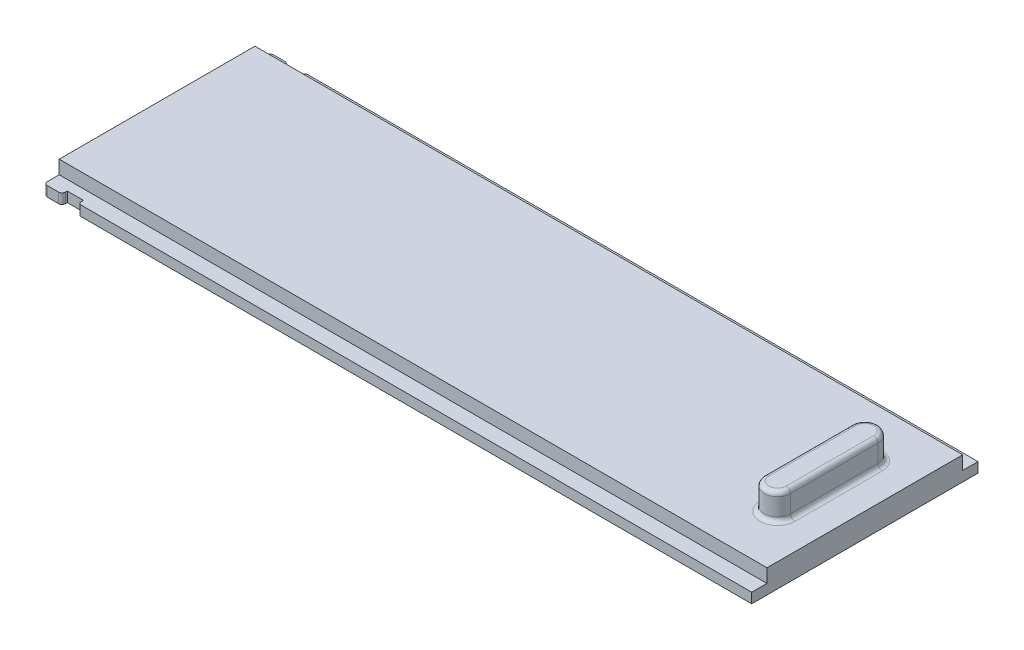
ISO-10303-21;
HEADER;
FILE_DESCRIPTION(('STEP AP214'),'2;1');
FILE_NAME('part.step','',(''),(''),'','','');
FILE_SCHEMA(('AUTOMOTIVE_DESIGN { 1 0 10303 214 1 1 1 1 }'));
ENDSEC;
DATA;
#1=APPLICATION_CONTEXT('core data for automotive mechanical design processes');
#2=APPLICATION_PROTOCOL_DEFINITION('international standard','automotive_design',2000,#1);
#3=PRODUCT_CONTEXT('',#1,'mechanical');
#4=PRODUCT('Part','Part','',(#3));
#5=PRODUCT_RELATED_PRODUCT_CATEGORY('part','',(#4));
#6=PRODUCT_DEFINITION_FORMATION('','',#4);
#7=PRODUCT_DEFINITION_CONTEXT('part definition',#1,'design');
#8=PRODUCT_DEFINITION('design','',#6,#7);
#9=PRODUCT_DEFINITION_SHAPE('','',#8);
#10=(LENGTH_UNIT() NAMED_UNIT(*) SI_UNIT(.MILLI.,.METRE.));
#11=(NAMED_UNIT(*) PLANE_ANGLE_UNIT() SI_UNIT($,.RADIAN.));
#12=(NAMED_UNIT(*) SI_UNIT($,.STERADIAN.) SOLID_ANGLE_UNIT());
#13=UNCERTAINTY_MEASURE_WITH_UNIT(LENGTH_MEASURE(1.E-05),#10,'distance_accuracy_value','');
#14=(GEOMETRIC_REPRESENTATION_CONTEXT(3) GLOBAL_UNCERTAINTY_ASSIGNED_CONTEXT((#13)) GLOBAL_UNIT_ASSIGNED_CONTEXT((#10,
#11,#12)) REPRESENTATION_CONTEXT('',''));
#15=CARTESIAN_POINT('',(0.,0.,0.));
#16=DIRECTION('',(0.,0.,1.));
#17=DIRECTION('',(1.,0.,0.));
#18=AXIS2_PLACEMENT_3D('',#15,#16,#17);
#19=CARTESIAN_POINT('',(0.,3.,0.));
#20=DIRECTION('',(0.,-1.,0.));
#21=DIRECTION('',(0.,0.,-1.));
#22=AXIS2_PLACEMENT_3D('',#19,#20,#21);
#23=PLANE('',#22);
#24=CARTESIAN_POINT('',(76.,3.,-9.49999999999999));
#25=DIRECTION('',(0.,-1.,0.));
#26=DIRECTION('',(0.,0.,-1.));
#27=AXIS2_PLACEMENT_3D('',#24,#25,#26);
#28=CIRCLE('',#27,2.);
#29=CARTESIAN_POINT('',(78.,3.,-9.49999999999999));
#30=VERTEX_POINT('',#29);
#31=CARTESIAN_POINT('',(74.,3.,-9.49999999999999));
#32=VERTEX_POINT('',#31);
#33=EDGE_CURVE('E369',#30,#32,#28,.T.);
#34=ORIENTED_EDGE('',*,*,#33,.T.);
#35=DIRECTION('',(0.,0.,1.));
#36=VECTOR('',#35,1.);
#37=CARTESIAN_POINT('',(74.,3.,-19.5));
#38=LINE('',#37,#36);
#39=CARTESIAN_POINT('',(74.,3.,-19.5));
#40=VERTEX_POINT('',#39);
#41=EDGE_CURVE('E375',#32,#40,#38,.F.);
#42=ORIENTED_EDGE('',*,*,#41,.T.);
#43=CARTESIAN_POINT('',(76.,3.,-19.5));
#44=DIRECTION('',(0.,-1.,0.));
#45=DIRECTION('',(0.,0.,-1.));
#46=AXIS2_PLACEMENT_3D('',#43,#44,#45);
#47=CIRCLE('',#46,2.);
#48=CARTESIAN_POINT('',(78.,3.,-19.5));
#49=VERTEX_POINT('',#48);
#50=EDGE_CURVE('E373',#40,#49,#47,.T.);
#51=ORIENTED_EDGE('',*,*,#50,.T.);
#52=DIRECTION('',(0.,0.,-1.));
#53=VECTOR('',#52,1.);
#54=CARTESIAN_POINT('',(78.,3.,-9.49999999999999));
#55=LINE('',#54,#53);
#56=EDGE_CURVE('E371',#49,#30,#55,.F.);
#57=ORIENTED_EDGE('',*,*,#56,.T.);
#58=EDGE_LOOP('',(#34,#42,#51,#57));
#59=FACE_BOUND('',#58,.T.);
#60=DIRECTION('',(0.,0.,-1.));
#61=VECTOR('',#60,1.);
#62=CARTESIAN_POINT('',(81.,3.,0.));
#63=LINE('',#62,#61);
#64=CARTESIAN_POINT('',(81.,3.,-3.3));
#65=VERTEX_POINT('',#64);
#66=CARTESIAN_POINT('',(81.,3.,-25.7));
#67=VERTEX_POINT('',#66);
#68=EDGE_CURVE('E299',#65,#67,#63,.T.);
#69=ORIENTED_EDGE('',*,*,#68,.T.);
#70=DIRECTION('',(1.,0.,0.));
#71=VECTOR('',#70,1.);
#72=CARTESIAN_POINT('',(-3.63352445980483,3.,-25.7));
#73=LINE('',#72,#71);
#74=CARTESIAN_POINT('',(0.,3.,-25.7));
#75=VERTEX_POINT('',#74);
#76=EDGE_CURVE('E262',#75,#67,#73,.T.);
#77=ORIENTED_EDGE('',*,*,#76,.F.);
#78=DIRECTION('',(0.,0.,1.));
#79=VECTOR('',#78,1.);
#80=CARTESIAN_POINT('',(0.,3.,0.));
#81=LINE('',#80,#79);
#82=CARTESIAN_POINT('',(0.,3.,-3.3));
#83=VERTEX_POINT('',#82);
#84=EDGE_CURVE('E296',#75,#83,#81,.T.);
#85=ORIENTED_EDGE('',*,*,#84,.T.);
#86=DIRECTION('',(1.,0.,0.));
#87=VECTOR('',#86,1.);
#88=CARTESIAN_POINT('',(-3.63352445980483,3.,-3.3));
#89=LINE('',#88,#87);
#90=EDGE_CURVE('E282',#83,#65,#89,.T.);
#91=ORIENTED_EDGE('',*,*,#90,.T.);
#92=EDGE_LOOP('',(#69,#77,#85,#91));
#93=FACE_BOUND('',#92,.T.);
#94=ADVANCED_FACE('F41',(#59,#93),#23,.F.);
#95=CARTESIAN_POINT('',(-3.63352445980483,0.,-27.45));
#96=DIRECTION('',(0.,0.,1.));
#97=DIRECTION('',(0.,-1.,0.));
#98=AXIS2_PLACEMENT_3D('',#95,#96,#97);
#99=PLANE('',#98);
#100=DIRECTION('',(0.,-1.,0.));
#101=VECTOR('',#100,1.);
#102=CARTESIAN_POINT('',(81.,0.,-27.45));
#103=LINE('',#102,#101);
#104=CARTESIAN_POINT('',(81.,1.45,-27.45));
#105=VERTEX_POINT('',#104);
#106=CARTESIAN_POINT('',(81.,0.3,-27.45));
#107=VERTEX_POINT('',#106);
#108=EDGE_CURVE('E254',#105,#107,#103,.T.);
#109=ORIENTED_EDGE('',*,*,#108,.T.);
#110=DIRECTION('',(1.,0.,0.));
#111=VECTOR('',#110,1.);
#112=CARTESIAN_POINT('',(-25.9001930494736,0.3,-27.45));
#113=LINE('',#112,#111);
#114=CARTESIAN_POINT('',(4.12500000000001,0.3,-27.45));
#115=VERTEX_POINT('',#114);
#116=EDGE_CURVE('E237',#115,#107,#113,.T.);
#117=ORIENTED_EDGE('',*,*,#116,.F.);
#118=DIRECTION('',(0.,1.,0.));
#119=VECTOR('',#118,1.);
#120=CARTESIAN_POINT('',(4.12500000000001,0.,-27.45));
#121=LINE('',#120,#119);
#122=CARTESIAN_POINT('',(4.12500000000001,1.45,-27.45));
#123=VERTEX_POINT('',#122);
#124=EDGE_CURVE('E328',#115,#123,#121,.T.);
#125=ORIENTED_EDGE('',*,*,#124,.T.);
#126=DIRECTION('',(1.,0.,0.));
#127=VECTOR('',#126,1.);
#128=CARTESIAN_POINT('',(-3.63352445980483,1.45,-27.45));
#129=LINE('',#128,#127);
#130=EDGE_CURVE('E260',#123,#105,#129,.T.);
#131=ORIENTED_EDGE('',*,*,#130,.T.);
#132=EDGE_LOOP('',(#109,#117,#125,#131));
#133=FACE_BOUND('',#132,.T.);
#134=ADVANCED_FACE('F258',(#133),#99,.F.);
#135=CARTESIAN_POINT('',(-3.63352445980483,0.,-1.55));
#136=DIRECTION('',(0.,0.,-1.));
#137=DIRECTION('',(0.,1.,0.));
#138=AXIS2_PLACEMENT_3D('',#135,#136,#137);
#139=PLANE('',#138);
#140=DIRECTION('',(0.,-1.,0.));
#141=VECTOR('',#140,1.);
#142=CARTESIAN_POINT('',(4.125,0.,-1.55));
#143=LINE('',#142,#141);
#144=CARTESIAN_POINT('',(4.125,1.45,-1.55));
#145=VERTEX_POINT('',#144);
#146=CARTESIAN_POINT('',(4.125,0.3,-1.55));
#147=VERTEX_POINT('',#146);
#148=EDGE_CURVE('E310',#145,#147,#143,.T.);
#149=ORIENTED_EDGE('',*,*,#148,.T.);
#150=DIRECTION('',(1.,0.,0.));
#151=VECTOR('',#150,1.);
#152=CARTESIAN_POINT('',(-25.9001930494736,0.3,-1.55));
#153=LINE('',#152,#151);
#154=CARTESIAN_POINT('',(81.,0.3,-1.55));
#155=VERTEX_POINT('',#154);
#156=EDGE_CURVE('E526',#147,#155,#153,.T.);
#157=ORIENTED_EDGE('',*,*,#156,.T.);
#158=DIRECTION('',(0.,1.,0.));
#159=VECTOR('',#158,1.);
#160=CARTESIAN_POINT('',(81.,0.,-1.55));
#161=LINE('',#160,#159);
#162=CARTESIAN_POINT('',(81.,1.45,-1.55));
#163=VERTEX_POINT('',#162);
#164=EDGE_CURVE('E256',#155,#163,#161,.T.);
#165=ORIENTED_EDGE('',*,*,#164,.T.);
#166=DIRECTION('',(1.,0.,0.));
#167=VECTOR('',#166,1.);
#168=CARTESIAN_POINT('',(-3.63352445980483,1.45,-1.55));
#169=LINE('',#168,#167);
#170=EDGE_CURVE('E279',#145,#163,#169,.T.);
#171=ORIENTED_EDGE('',*,*,#170,.F.);
#172=EDGE_LOOP('',(#149,#157,#165,#171));
#173=FACE_BOUND('',#172,.T.);
#174=ADVANCED_FACE('F548',(#173),#139,.F.);
#175=CARTESIAN_POINT('',(0.,3.,0.));
#176=DIRECTION('',(1.,0.,0.));
#177=DIRECTION('',(0.,0.,-1.));
#178=AXIS2_PLACEMENT_3D('',#175,#176,#177);
#179=PLANE('',#178);
#180=DIRECTION('',(0.,1.,0.));
#181=VECTOR('',#180,1.);
#182=CARTESIAN_POINT('',(0.,2.99999999999994,-27.05));
#183=LINE('',#182,#181);
#184=CARTESIAN_POINT('',(0.,1.45,-27.05));
#185=VERTEX_POINT('',#184);
#186=CARTESIAN_POINT('',(0.,0.3,-27.05));
#187=VERTEX_POINT('',#186);
#188=EDGE_CURVE('E338',#185,#187,#183,.F.);
#189=ORIENTED_EDGE('',*,*,#188,.T.);
#190=DIRECTION('',(0.,0.,-1.));
#191=VECTOR('',#190,1.);
#192=CARTESIAN_POINT('',(0.,0.3,-1.55));
#193=LINE('',#192,#191);
#194=CARTESIAN_POINT('',(0.,0.3,-1.95));
#195=VERTEX_POINT('',#194);
#196=EDGE_CURVE('E491',#195,#187,#193,.T.);
#197=ORIENTED_EDGE('',*,*,#196,.F.);
#198=DIRECTION('',(0.,-1.,0.));
#199=VECTOR('',#198,1.);
#200=CARTESIAN_POINT('',(0.,3.,-1.95));
#201=LINE('',#200,#199);
#202=CARTESIAN_POINT('',(0.,1.45,-1.95));
#203=VERTEX_POINT('',#202);
#204=EDGE_CURVE('E336',#195,#203,#201,.F.);
#205=ORIENTED_EDGE('',*,*,#204,.T.);
#206=DIRECTION('',(0.,0.,1.));
#207=VECTOR('',#206,1.);
#208=CARTESIAN_POINT('',(0.,1.45,-1.55));
#209=LINE('',#208,#207);
#210=CARTESIAN_POINT('',(0.,1.45,-3.3));
#211=VERTEX_POINT('',#210);
#212=EDGE_CURVE('E285',#211,#203,#209,.T.);
#213=ORIENTED_EDGE('',*,*,#212,.F.);
#214=DIRECTION('',(0.,-1.,0.));
#215=VECTOR('',#214,1.);
#216=CARTESIAN_POINT('',(0.,1.45,-3.3));
#217=LINE('',#216,#215);
#218=EDGE_CURVE('E291',#83,#211,#217,.T.);
#219=ORIENTED_EDGE('',*,*,#218,.F.);
#220=ORIENTED_EDGE('',*,*,#84,.F.);
#221=DIRECTION('',(0.,1.,0.));
#222=VECTOR('',#221,1.);
#223=CARTESIAN_POINT('',(0.,1.45,-25.7));
#224=LINE('',#223,#222);
#225=CARTESIAN_POINT('',(0.,1.45,-25.7));
#226=VERTEX_POINT('',#225);
#227=EDGE_CURVE('E273',#226,#75,#224,.T.);
#228=ORIENTED_EDGE('',*,*,#227,.F.);
#229=DIRECTION('',(0.,0.,1.));
#230=VECTOR('',#229,1.);
#231=CARTESIAN_POINT('',(0.,1.45,-27.45));
#232=LINE('',#231,#230);
#233=EDGE_CURVE('E300',#185,#226,#232,.T.);
#234=ORIENTED_EDGE('',*,*,#233,.F.);
#235=EDGE_LOOP('',(#189,#197,#205,#213,#219,#220,#228,#234));
#236=FACE_BOUND('',#235,.T.);
#237=ADVANCED_FACE('F482',(#236),#179,.F.);
#238=CARTESIAN_POINT('',(81.,3.,0.));
#239=DIRECTION('',(-1.,0.,0.));
#240=DIRECTION('',(0.,0.,1.));
#241=AXIS2_PLACEMENT_3D('',#238,#239,#240);
#242=PLANE('',#241);
#243=ORIENTED_EDGE('',*,*,#164,.F.);
#244=DIRECTION('',(0.,0.,1.));
#245=VECTOR('',#244,1.);
#246=CARTESIAN_POINT('',(81.,0.3,-1.55));
#247=LINE('',#246,#245);
#248=EDGE_CURVE('E240',#107,#155,#247,.T.);
#249=ORIENTED_EDGE('',*,*,#248,.F.);
#250=ORIENTED_EDGE('',*,*,#108,.F.);
#251=DIRECTION('',(0.,0.,-1.));
#252=VECTOR('',#251,1.);
#253=CARTESIAN_POINT('',(81.,1.45,-27.45));
#254=LINE('',#253,#252);
#255=CARTESIAN_POINT('',(81.,1.45,-25.7));
#256=VERTEX_POINT('',#255);
#257=EDGE_CURVE('E263',#256,#105,#254,.T.);
#258=ORIENTED_EDGE('',*,*,#257,.F.);
#259=DIRECTION('',(0.,-1.,0.));
#260=VECTOR('',#259,1.);
#261=CARTESIAN_POINT('',(81.,1.45,-25.7));
#262=LINE('',#261,#260);
#263=EDGE_CURVE('E267',#67,#256,#262,.T.);
#264=ORIENTED_EDGE('',*,*,#263,.F.);
#265=ORIENTED_EDGE('',*,*,#68,.F.);
#266=DIRECTION('',(0.,1.,0.));
#267=VECTOR('',#266,1.);
#268=CARTESIAN_POINT('',(81.,1.45,-3.3));
#269=LINE('',#268,#267);
#270=CARTESIAN_POINT('',(81.,1.45,-3.3));
#271=VERTEX_POINT('',#270);
#272=EDGE_CURVE('E278',#271,#65,#269,.T.);
#273=ORIENTED_EDGE('',*,*,#272,.F.);
#274=DIRECTION('',(0.,0.,-1.));
#275=VECTOR('',#274,1.);
#276=CARTESIAN_POINT('',(81.,1.45,-1.55));
#277=LINE('',#276,#275);
#278=EDGE_CURVE('E287',#163,#271,#277,.T.);
#279=ORIENTED_EDGE('',*,*,#278,.F.);
#280=EDGE_LOOP('',(#243,#249,#250,#258,#264,#265,#273,#279));
#281=FACE_BOUND('',#280,.T.);
#282=ADVANCED_FACE('F252',(#281),#242,.F.);
#283=CARTESIAN_POINT('',(-3.63352445980483,1.45,-3.3));
#284=DIRECTION('',(0.,0.,-1.));
#285=DIRECTION('',(0.,1.,0.));
#286=AXIS2_PLACEMENT_3D('',#283,#284,#285);
#287=PLANE('',#286);
#288=ORIENTED_EDGE('',*,*,#218,.T.);
#289=DIRECTION('',(1.,0.,0.));
#290=VECTOR('',#289,1.);
#291=CARTESIAN_POINT('',(-3.63352445980483,1.45,-3.3));
#292=LINE('',#291,#290);
#293=EDGE_CURVE('E280',#211,#271,#292,.T.);
#294=ORIENTED_EDGE('',*,*,#293,.T.);
#295=ORIENTED_EDGE('',*,*,#272,.T.);
#296=ORIENTED_EDGE('',*,*,#90,.F.);
#297=EDGE_LOOP('',(#288,#294,#295,#296));
#298=FACE_BOUND('',#297,.T.);
#299=ADVANCED_FACE('F552',(#298),#287,.F.);
#300=CARTESIAN_POINT('',(-3.63352445980483,1.45,-1.55));
#301=DIRECTION('',(0.,-1.,0.));
#302=DIRECTION('',(0.,0.,-1.));
#303=AXIS2_PLACEMENT_3D('',#300,#301,#302);
#304=PLANE('',#303);
#305=ORIENTED_EDGE('',*,*,#212,.T.);
#306=CARTESIAN_POINT('',(0.4,1.45,-1.95));
#307=DIRECTION('',(0.,-1.,0.));
#308=DIRECTION('',(0.,0.,-1.));
#309=AXIS2_PLACEMENT_3D('',#306,#307,#308);
#310=CIRCLE('',#309,0.4);
#311=CARTESIAN_POINT('',(0.4,1.45,-1.55));
#312=VERTEX_POINT('',#311);
#313=EDGE_CURVE('E344',#203,#312,#310,.F.);
#314=ORIENTED_EDGE('',*,*,#313,.T.);
#315=CARTESIAN_POINT('',(1.675,1.45,-1.55));
#316=VERTEX_POINT('',#315);
#317=EDGE_CURVE('E275',#312,#316,#169,.T.);
#318=ORIENTED_EDGE('',*,*,#317,.T.);
#319=CARTESIAN_POINT('',(1.675,1.45,-1.95));
#320=DIRECTION('',(0.,-1.,0.));
#321=DIRECTION('',(0.,0.,-1.));
#322=AXIS2_PLACEMENT_3D('',#319,#320,#321);
#323=CIRCLE('',#322,0.4);
#324=CARTESIAN_POINT('',(2.075,1.45,-1.95));
#325=VERTEX_POINT('',#324);
#326=EDGE_CURVE('E308',#316,#325,#323,.F.);
#327=ORIENTED_EDGE('',*,*,#326,.T.);
#328=DIRECTION('',(0.,0.,1.));
#329=VECTOR('',#328,1.);
#330=CARTESIAN_POINT('',(2.075,1.45,-2.15));
#331=LINE('',#330,#329);
#332=CARTESIAN_POINT('',(2.075,1.45,-2.15));
#333=VERTEX_POINT('',#332);
#334=EDGE_CURVE('E293',#333,#325,#331,.T.);
#335=ORIENTED_EDGE('',*,*,#334,.F.);
#336=DIRECTION('',(-1.,0.,0.));
#337=VECTOR('',#336,1.);
#338=CARTESIAN_POINT('',(2.075,1.45,-2.15));
#339=LINE('',#338,#337);
#340=CARTESIAN_POINT('',(3.925,1.45,-2.15));
#341=VERTEX_POINT('',#340);
#342=EDGE_CURVE('E454',#341,#333,#339,.T.);
#343=ORIENTED_EDGE('',*,*,#342,.F.);
#344=DIRECTION('',(0.,0.,1.));
#345=VECTOR('',#344,1.);
#346=CARTESIAN_POINT('',(3.925,1.45,-2.15));
#347=LINE('',#346,#345);
#348=CARTESIAN_POINT('',(3.925,1.45,-1.75));
#349=VERTEX_POINT('',#348);
#350=EDGE_CURVE('E460',#341,#349,#347,.T.);
#351=ORIENTED_EDGE('',*,*,#350,.T.);
#352=DIRECTION('',(-0.707106781186543,0.,-0.707106781186552));
#353=VECTOR('',#352,1.);
#354=CARTESIAN_POINT('',(4.125,1.45,-1.55));
#355=LINE('',#354,#353);
#356=EDGE_CURVE('E315',#349,#145,#355,.F.);
#357=ORIENTED_EDGE('',*,*,#356,.T.);
#358=ORIENTED_EDGE('',*,*,#170,.T.);
#359=ORIENTED_EDGE('',*,*,#278,.T.);
#360=ORIENTED_EDGE('',*,*,#293,.F.);
#361=EDGE_LOOP('',(#305,#314,#318,#327,#335,#343,#351,#357,#358,#359,#360));
#362=FACE_BOUND('',#361,.T.);
#363=ADVANCED_FACE('F531',(#362),#304,.F.);
#364=DIRECTION('',(0.,-1.,0.));
#365=VECTOR('',#364,1.);
#366=CARTESIAN_POINT('',(0.4,0.,-1.55));
#367=LINE('',#366,#365);
#368=CARTESIAN_POINT('',(0.4,0.3,-1.55));
#369=VERTEX_POINT('',#368);
#370=EDGE_CURVE('E341',#312,#369,#367,.T.);
#371=ORIENTED_EDGE('',*,*,#370,.T.);
#372=CARTESIAN_POINT('',(1.675,0.3,-1.55));
#373=VERTEX_POINT('',#372);
#374=EDGE_CURVE('E55',#369,#373,#153,.T.);
#375=ORIENTED_EDGE('',*,*,#374,.T.);
#376=DIRECTION('',(0.,-1.,0.));
#377=VECTOR('',#376,1.);
#378=CARTESIAN_POINT('',(1.675,0.,-1.55));
#379=LINE('',#378,#377);
#380=EDGE_CURVE('E306',#373,#316,#379,.F.);
#381=ORIENTED_EDGE('',*,*,#380,.T.);
#382=ORIENTED_EDGE('',*,*,#317,.F.);
#383=EDGE_LOOP('',(#371,#375,#381,#382));
#384=FACE_BOUND('',#383,.T.);
#385=ADVANCED_FACE('F523',(#384),#139,.F.);
#386=DIRECTION('',(0.,1.,0.));
#387=VECTOR('',#386,1.);
#388=CARTESIAN_POINT('',(1.675,0.,-27.45));
#389=LINE('',#388,#387);
#390=CARTESIAN_POINT('',(1.675,1.45,-27.45));
#391=VERTEX_POINT('',#390);
#392=CARTESIAN_POINT('',(1.675,0.3,-27.45));
#393=VERTEX_POINT('',#392);
#394=EDGE_CURVE('E322',#391,#393,#389,.F.);
#395=ORIENTED_EDGE('',*,*,#394,.T.);
#396=CARTESIAN_POINT('',(0.400000000000001,0.3,-27.45));
#397=VERTEX_POINT('',#396);
#398=EDGE_CURVE('E247',#397,#393,#113,.T.);
#399=ORIENTED_EDGE('',*,*,#398,.F.);
#400=DIRECTION('',(0.,1.,0.));
#401=VECTOR('',#400,1.);
#402=CARTESIAN_POINT('',(0.4,0.,-27.45));
#403=LINE('',#402,#401);
#404=CARTESIAN_POINT('',(0.4,1.45,-27.45));
#405=VERTEX_POINT('',#404);
#406=EDGE_CURVE('E332',#397,#405,#403,.T.);
#407=ORIENTED_EDGE('',*,*,#406,.T.);
#408=EDGE_CURVE('E271',#405,#391,#129,.T.);
#409=ORIENTED_EDGE('',*,*,#408,.T.);
#410=EDGE_LOOP('',(#395,#399,#407,#409));
#411=FACE_BOUND('',#410,.T.);
#412=ADVANCED_FACE('F578',(#411),#99,.F.);
#413=CARTESIAN_POINT('',(-3.63352445980483,1.45,-27.45));
#414=DIRECTION('',(0.,-1.,0.));
#415=DIRECTION('',(0.,0.,-1.));
#416=AXIS2_PLACEMENT_3D('',#413,#414,#415);
#417=PLANE('',#416);
#418=ORIENTED_EDGE('',*,*,#408,.F.);
#419=CARTESIAN_POINT('',(0.4,1.45,-27.05));
#420=DIRECTION('',(0.,-1.,0.));
#421=DIRECTION('',(0.,0.,-1.));
#422=AXIS2_PLACEMENT_3D('',#419,#420,#421);
#423=CIRCLE('',#422,0.4);
#424=EDGE_CURVE('E334',#405,#185,#423,.F.);
#425=ORIENTED_EDGE('',*,*,#424,.T.);
#426=ORIENTED_EDGE('',*,*,#233,.T.);
#427=DIRECTION('',(1.,0.,0.));
#428=VECTOR('',#427,1.);
#429=CARTESIAN_POINT('',(-3.63352445980483,1.45,-25.7));
#430=LINE('',#429,#428);
#431=EDGE_CURVE('E265',#226,#256,#430,.T.);
#432=ORIENTED_EDGE('',*,*,#431,.T.);
#433=ORIENTED_EDGE('',*,*,#257,.T.);
#434=ORIENTED_EDGE('',*,*,#130,.F.);
#435=DIRECTION('',(0.707106781186548,0.,-0.707106781186548));
#436=VECTOR('',#435,1.);
#437=CARTESIAN_POINT('',(3.925,1.45,-27.25));
#438=LINE('',#437,#436);
#439=CARTESIAN_POINT('',(3.925,1.45,-27.25));
#440=VERTEX_POINT('',#439);
#441=EDGE_CURVE('E330',#123,#440,#438,.F.);
#442=ORIENTED_EDGE('',*,*,#441,.T.);
#443=DIRECTION('',(0.,0.,-1.));
#444=VECTOR('',#443,1.);
#445=CARTESIAN_POINT('',(3.925,1.45,-26.85));
#446=LINE('',#445,#444);
#447=CARTESIAN_POINT('',(3.925,1.45,-26.85));
#448=VERTEX_POINT('',#447);
#449=EDGE_CURVE('E447',#448,#440,#446,.T.);
#450=ORIENTED_EDGE('',*,*,#449,.F.);
#451=DIRECTION('',(1.,0.,0.));
#452=VECTOR('',#451,1.);
#453=CARTESIAN_POINT('',(2.075,1.45,-26.85));
#454=LINE('',#453,#452);
#455=CARTESIAN_POINT('',(2.075,1.45,-26.85));
#456=VERTEX_POINT('',#455);
#457=EDGE_CURVE('E443',#456,#448,#454,.T.);
#458=ORIENTED_EDGE('',*,*,#457,.F.);
#459=DIRECTION('',(0.,0.,-1.));
#460=VECTOR('',#459,1.);
#461=CARTESIAN_POINT('',(2.075,1.45,-26.85));
#462=LINE('',#461,#460);
#463=CARTESIAN_POINT('',(2.075,1.45,-27.05));
#464=VERTEX_POINT('',#463);
#465=EDGE_CURVE('E446',#456,#464,#462,.T.);
#466=ORIENTED_EDGE('',*,*,#465,.T.);
#467=CARTESIAN_POINT('',(1.675,1.45,-27.05));
#468=DIRECTION('',(0.,-1.,0.));
#469=DIRECTION('',(0.,0.,-1.));
#470=AXIS2_PLACEMENT_3D('',#467,#468,#469);
#471=CIRCLE('',#470,0.4);
#472=EDGE_CURVE('E319',#464,#391,#471,.F.);
#473=ORIENTED_EDGE('',*,*,#472,.T.);
#474=EDGE_LOOP('',(#418,#425,#426,#432,#433,#434,#442,#450,#458,#466,#473));
#475=FACE_BOUND('',#474,.T.);
#476=ADVANCED_FACE('F476',(#475),#417,.F.);
#477=CARTESIAN_POINT('',(-3.63352445980483,1.45,-25.7));
#478=DIRECTION('',(0.,0.,1.));
#479=DIRECTION('',(1.,0.,0.));
#480=AXIS2_PLACEMENT_3D('',#477,#478,#479);
#481=PLANE('',#480);
#482=ORIENTED_EDGE('',*,*,#227,.T.);
#483=ORIENTED_EDGE('',*,*,#76,.T.);
#484=ORIENTED_EDGE('',*,*,#263,.T.);
#485=ORIENTED_EDGE('',*,*,#431,.F.);
#486=EDGE_LOOP('',(#482,#483,#484,#485));
#487=FACE_BOUND('',#486,.T.);
#488=ADVANCED_FACE('F470',(#487),#481,.F.);
#489=CARTESIAN_POINT('',(3.925,-0.0999999999999997,-2.15));
#490=DIRECTION('',(1.,0.,0.));
#491=DIRECTION('',(0.,0.,-1.));
#492=AXIS2_PLACEMENT_3D('',#489,#490,#491);
#493=PLANE('',#492);
#494=DIRECTION('',(0.,1.,0.));
#495=VECTOR('',#494,1.);
#496=CARTESIAN_POINT('',(3.925,-0.0999999999999997,-2.15));
#497=LINE('',#496,#495);
#498=CARTESIAN_POINT('',(3.925,0.3,-2.15));
#499=VERTEX_POINT('',#498);
#500=EDGE_CURVE('E450',#499,#341,#497,.T.);
#501=ORIENTED_EDGE('',*,*,#500,.F.);
#502=DIRECTION('',(0.,0.,1.));
#503=VECTOR('',#502,1.);
#504=CARTESIAN_POINT('',(3.925,0.3,-2.15));
#505=LINE('',#504,#503);
#506=CARTESIAN_POINT('',(3.925,0.3,-1.75));
#507=VERTEX_POINT('',#506);
#508=EDGE_CURVE('E510',#499,#507,#505,.T.);
#509=ORIENTED_EDGE('',*,*,#508,.T.);
#510=DIRECTION('',(0.,1.,0.));
#511=VECTOR('',#510,1.);
#512=CARTESIAN_POINT('',(3.925,-0.0999999999999998,-1.75));
#513=LINE('',#512,#511);
#514=EDGE_CURVE('E313',#507,#349,#513,.T.);
#515=ORIENTED_EDGE('',*,*,#514,.T.);
#516=ORIENTED_EDGE('',*,*,#350,.F.);
#517=EDGE_LOOP('',(#501,#509,#515,#516));
#518=FACE_BOUND('',#517,.T.);
#519=ADVANCED_FACE('F628',(#518),#493,.F.);
#520=CARTESIAN_POINT('',(2.075,-0.0999999999999997,-2.15));
#521=DIRECTION('',(-1.,0.,0.));
#522=DIRECTION('',(0.,0.,1.));
#523=AXIS2_PLACEMENT_3D('',#520,#521,#522);
#524=PLANE('',#523);
#525=DIRECTION('',(0.,-1.,0.));
#526=VECTOR('',#525,1.);
#527=CARTESIAN_POINT('',(2.075,-0.0999999999999997,-1.95));
#528=LINE('',#527,#526);
#529=CARTESIAN_POINT('',(2.075,0.3,-1.95));
#530=VERTEX_POINT('',#529);
#531=EDGE_CURVE('E303',#325,#530,#528,.T.);
#532=ORIENTED_EDGE('',*,*,#531,.T.);
#533=DIRECTION('',(0.,0.,-1.));
#534=VECTOR('',#533,1.);
#535=CARTESIAN_POINT('',(2.075,0.3,-2.15));
#536=LINE('',#535,#534);
#537=CARTESIAN_POINT('',(2.075,0.3,-2.15));
#538=VERTEX_POINT('',#537);
#539=EDGE_CURVE('E515',#530,#538,#536,.T.);
#540=ORIENTED_EDGE('',*,*,#539,.T.);
#541=DIRECTION('',(0.,-1.,0.));
#542=VECTOR('',#541,1.);
#543=CARTESIAN_POINT('',(2.075,-0.0999999999999997,-2.15));
#544=LINE('',#543,#542);
#545=EDGE_CURVE('E457',#333,#538,#544,.T.);
#546=ORIENTED_EDGE('',*,*,#545,.F.);
#547=ORIENTED_EDGE('',*,*,#334,.T.);
#548=EDGE_LOOP('',(#532,#540,#546,#547));
#549=FACE_BOUND('',#548,.T.);
#550=ADVANCED_FACE('F533',(#549),#524,.F.);
#551=CARTESIAN_POINT('',(0.,0.,-2.15));
#552=DIRECTION('',(0.,0.,-1.));
#553=DIRECTION('',(-1.,0.,0.));
#554=AXIS2_PLACEMENT_3D('',#551,#552,#553);
#555=PLANE('',#554);
#556=ORIENTED_EDGE('',*,*,#545,.T.);
#557=DIRECTION('',(1.,0.,0.));
#558=VECTOR('',#557,1.);
#559=CARTESIAN_POINT('',(0.,0.3,-2.15));
#560=LINE('',#559,#558);
#561=EDGE_CURVE('E513',#538,#499,#560,.T.);
#562=ORIENTED_EDGE('',*,*,#561,.T.);
#563=ORIENTED_EDGE('',*,*,#500,.T.);
#564=ORIENTED_EDGE('',*,*,#342,.T.);
#565=EDGE_LOOP('',(#556,#562,#563,#564));
#566=FACE_BOUND('',#565,.T.);
#567=ADVANCED_FACE('F535',(#566),#555,.F.);
#568=CARTESIAN_POINT('',(1.675,-0.0999999999999997,-1.95));
#569=DIRECTION('',(0.,-1.,0.));
#570=DIRECTION('',(0.,0.,-1.));
#571=AXIS2_PLACEMENT_3D('',#568,#569,#570);
#572=CYLINDRICAL_SURFACE('',#571,0.4);
#573=CARTESIAN_POINT('',(1.675,0.3,-1.95));
#574=DIRECTION('',(0.,1.,0.));
#575=DIRECTION('',(0.,0.,1.));
#576=AXIS2_PLACEMENT_3D('',#573,#574,#575);
#577=CIRCLE('',#576,0.4);
#578=EDGE_CURVE('E395',#530,#373,#577,.F.);
#579=ORIENTED_EDGE('',*,*,#578,.F.);
#580=ORIENTED_EDGE('',*,*,#531,.F.);
#581=ORIENTED_EDGE('',*,*,#326,.F.);
#582=ORIENTED_EDGE('',*,*,#380,.F.);
#583=EDGE_LOOP('',(#579,#580,#581,#582));
#584=FACE_BOUND('',#583,.T.);
#585=ADVANCED_FACE('F528',(#584),#572,.T.);
#586=CARTESIAN_POINT('',(4.125,0.,-1.55));
#587=DIRECTION('',(0.707106781186552,0.,-0.707106781186543));
#588=DIRECTION('',(0.,-1.,0.));
#589=AXIS2_PLACEMENT_3D('',#586,#587,#588);
#590=PLANE('',#589);
#591=DIRECTION('',(0.707106781186543,0.,0.707106781186552));
#592=VECTOR('',#591,1.);
#593=CARTESIAN_POINT('',(4.125,0.3,-1.55));
#594=LINE('',#593,#592);
#595=EDGE_CURVE('E508',#147,#507,#594,.F.);
#596=ORIENTED_EDGE('',*,*,#595,.F.);
#597=ORIENTED_EDGE('',*,*,#148,.F.);
#598=ORIENTED_EDGE('',*,*,#356,.F.);
#599=ORIENTED_EDGE('',*,*,#514,.F.);
#600=EDGE_LOOP('',(#596,#597,#598,#599));
#601=FACE_BOUND('',#600,.T.);
#602=ADVANCED_FACE('F546',(#601),#590,.F.);
#603=CARTESIAN_POINT('',(3.925,1.45,-26.85));
#604=DIRECTION('',(1.,0.,0.));
#605=DIRECTION('',(0.,0.,-1.));
#606=AXIS2_PLACEMENT_3D('',#603,#604,#605);
#607=PLANE('',#606);
#608=DIRECTION('',(0.,-1.,0.));
#609=VECTOR('',#608,1.);
#610=CARTESIAN_POINT('',(3.925,1.45,-27.25));
#611=LINE('',#610,#609);
#612=CARTESIAN_POINT('',(3.925,0.3,-27.25));
#613=VERTEX_POINT('',#612);
#614=EDGE_CURVE('E325',#440,#613,#611,.T.);
#615=ORIENTED_EDGE('',*,*,#614,.T.);
#616=DIRECTION('',(0.,0.,1.));
#617=VECTOR('',#616,1.);
#618=CARTESIAN_POINT('',(3.925,0.3,-26.85));
#619=LINE('',#618,#617);
#620=CARTESIAN_POINT('',(3.925,0.3,-26.85));
#621=VERTEX_POINT('',#620);
#622=EDGE_CURVE('E493',#613,#621,#619,.T.);
#623=ORIENTED_EDGE('',*,*,#622,.T.);
#624=DIRECTION('',(0.,-1.,0.));
#625=VECTOR('',#624,1.);
#626=CARTESIAN_POINT('',(3.925,1.45,-26.85));
#627=LINE('',#626,#625);
#628=EDGE_CURVE('E438',#448,#621,#627,.T.);
#629=ORIENTED_EDGE('',*,*,#628,.F.);
#630=ORIENTED_EDGE('',*,*,#449,.T.);
#631=EDGE_LOOP('',(#615,#623,#629,#630));
#632=FACE_BOUND('',#631,.T.);
#633=ADVANCED_FACE('F594',(#632),#607,.F.);
#634=CARTESIAN_POINT('',(2.075,1.45,-26.85));
#635=DIRECTION('',(-1.,0.,0.));
#636=DIRECTION('',(0.,0.,1.));
#637=AXIS2_PLACEMENT_3D('',#634,#635,#636);
#638=PLANE('',#637);
#639=DIRECTION('',(0.,1.,0.));
#640=VECTOR('',#639,1.);
#641=CARTESIAN_POINT('',(2.075,1.45,-26.85));
#642=LINE('',#641,#640);
#643=CARTESIAN_POINT('',(2.075,0.3,-26.85));
#644=VERTEX_POINT('',#643);
#645=EDGE_CURVE('E441',#644,#456,#642,.T.);
#646=ORIENTED_EDGE('',*,*,#645,.F.);
#647=DIRECTION('',(0.,0.,-1.));
#648=VECTOR('',#647,1.);
#649=CARTESIAN_POINT('',(2.075,0.3,-26.85));
#650=LINE('',#649,#648);
#651=CARTESIAN_POINT('',(2.075,0.3,-27.05));
#652=VERTEX_POINT('',#651);
#653=EDGE_CURVE('E503',#644,#652,#650,.T.);
#654=ORIENTED_EDGE('',*,*,#653,.T.);
#655=DIRECTION('',(0.,1.,0.));
#656=VECTOR('',#655,1.);
#657=CARTESIAN_POINT('',(2.075,1.45,-27.05));
#658=LINE('',#657,#656);
#659=EDGE_CURVE('E317',#652,#464,#658,.T.);
#660=ORIENTED_EDGE('',*,*,#659,.T.);
#661=ORIENTED_EDGE('',*,*,#465,.F.);
#662=EDGE_LOOP('',(#646,#654,#660,#661));
#663=FACE_BOUND('',#662,.T.);
#664=ADVANCED_FACE('F614',(#663),#638,.F.);
#665=CARTESIAN_POINT('',(0.,0.,-26.85));
#666=DIRECTION('',(0.,0.,1.));
#667=DIRECTION('',(1.,0.,0.));
#668=AXIS2_PLACEMENT_3D('',#665,#666,#667);
#669=PLANE('',#668);
#670=ORIENTED_EDGE('',*,*,#628,.T.);
#671=DIRECTION('',(-1.,0.,0.));
#672=VECTOR('',#671,1.);
#673=CARTESIAN_POINT('',(0.,0.3,-26.85));
#674=LINE('',#673,#672);
#675=EDGE_CURVE('E500',#621,#644,#674,.T.);
#676=ORIENTED_EDGE('',*,*,#675,.T.);
#677=ORIENTED_EDGE('',*,*,#645,.T.);
#678=ORIENTED_EDGE('',*,*,#457,.T.);
#679=EDGE_LOOP('',(#670,#676,#677,#678));
#680=FACE_BOUND('',#679,.T.);
#681=ADVANCED_FACE('F598',(#680),#669,.F.);
#682=CARTESIAN_POINT('',(1.675,1.45,-27.05));
#683=DIRECTION('',(0.,1.,0.));
#684=DIRECTION('',(0.,0.,1.));
#685=AXIS2_PLACEMENT_3D('',#682,#683,#684);
#686=CYLINDRICAL_SURFACE('',#685,0.4);
#687=CARTESIAN_POINT('',(1.675,0.3,-27.05));
#688=DIRECTION('',(0.,1.,0.));
#689=DIRECTION('',(0.,0.,1.));
#690=AXIS2_PLACEMENT_3D('',#687,#688,#689);
#691=CIRCLE('',#690,0.4);
#692=EDGE_CURVE('E506',#393,#652,#691,.F.);
#693=ORIENTED_EDGE('',*,*,#692,.F.);
#694=ORIENTED_EDGE('',*,*,#394,.F.);
#695=ORIENTED_EDGE('',*,*,#472,.F.);
#696=ORIENTED_EDGE('',*,*,#659,.F.);
#697=EDGE_LOOP('',(#693,#694,#695,#696));
#698=FACE_BOUND('',#697,.T.);
#699=ADVANCED_FACE('F595',(#698),#686,.T.);
#700=CARTESIAN_POINT('',(3.925,1.45,-27.25));
#701=DIRECTION('',(0.707106781186547,0.,0.707106781186547));
#702=DIRECTION('',(0.,-1.,0.));
#703=AXIS2_PLACEMENT_3D('',#700,#701,#702);
#704=PLANE('',#703);
#705=DIRECTION('',(-0.707106781186547,0.,0.707106781186547));
#706=VECTOR('',#705,1.);
#707=CARTESIAN_POINT('',(3.925,0.3,-27.25));
#708=LINE('',#707,#706);
#709=EDGE_CURVE('E243',#613,#115,#708,.F.);
#710=ORIENTED_EDGE('',*,*,#709,.F.);
#711=ORIENTED_EDGE('',*,*,#614,.F.);
#712=ORIENTED_EDGE('',*,*,#441,.F.);
#713=ORIENTED_EDGE('',*,*,#124,.F.);
#714=EDGE_LOOP('',(#710,#711,#712,#713));
#715=FACE_BOUND('',#714,.T.);
#716=ADVANCED_FACE('F568',(#715),#704,.F.);
#717=CARTESIAN_POINT('',(0.4,0.,-27.05));
#718=DIRECTION('',(0.,1.,0.));
#719=DIRECTION('',(0.,0.,1.));
#720=AXIS2_PLACEMENT_3D('',#717,#718,#719);
#721=CYLINDRICAL_SURFACE('',#720,0.4);
#722=CARTESIAN_POINT('',(0.4,0.3,-27.05));
#723=DIRECTION('',(0.,1.,0.));
#724=DIRECTION('',(0.,0.,1.));
#725=AXIS2_PLACEMENT_3D('',#722,#723,#724);
#726=CIRCLE('',#725,0.4);
#727=EDGE_CURVE('E489',#187,#397,#726,.F.);
#728=ORIENTED_EDGE('',*,*,#727,.F.);
#729=ORIENTED_EDGE('',*,*,#188,.F.);
#730=ORIENTED_EDGE('',*,*,#424,.F.);
#731=ORIENTED_EDGE('',*,*,#406,.F.);
#732=EDGE_LOOP('',(#728,#729,#730,#731));
#733=FACE_BOUND('',#732,.T.);
#734=ADVANCED_FACE('F487',(#733),#721,.T.);
#735=CARTESIAN_POINT('',(0.4,0.,-1.95));
#736=DIRECTION('',(0.,-1.,0.));
#737=DIRECTION('',(0.,0.,-1.));
#738=AXIS2_PLACEMENT_3D('',#735,#736,#737);
#739=CYLINDRICAL_SURFACE('',#738,0.4);
#740=CARTESIAN_POINT('',(0.4,0.3,-1.95));
#741=DIRECTION('',(0.,1.,0.));
#742=DIRECTION('',(0.,0.,1.));
#743=AXIS2_PLACEMENT_3D('',#740,#741,#742);
#744=CIRCLE('',#743,0.4);
#745=EDGE_CURVE('E11',#369,#195,#744,.F.);
#746=ORIENTED_EDGE('',*,*,#745,.F.);
#747=ORIENTED_EDGE('',*,*,#370,.F.);
#748=ORIENTED_EDGE('',*,*,#313,.F.);
#749=ORIENTED_EDGE('',*,*,#204,.F.);
#750=EDGE_LOOP('',(#746,#747,#748,#749));
#751=FACE_BOUND('',#750,.T.);
#752=ADVANCED_FACE('F558',(#751),#739,.T.);
#753=CARTESIAN_POINT('',(76.,6.,-9.49999999999999));
#754=DIRECTION('',(0.,-1.,0.));
#755=DIRECTION('',(0.,0.,-1.));
#756=AXIS2_PLACEMENT_3D('',#753,#754,#755);
#757=CYLINDRICAL_SURFACE('',#756,1.5);
#758=DIRECTION('',(0.,-1.,0.));
#759=VECTOR('',#758,1.);
#760=CARTESIAN_POINT('',(77.5,6.,-9.49999999999999));
#761=LINE('',#760,#759);
#762=CARTESIAN_POINT('',(77.5,5.5,-9.49999999999999));
#763=VERTEX_POINT('',#762);
#764=CARTESIAN_POINT('',(77.5,3.5,-9.49999999999999));
#765=VERTEX_POINT('',#764);
#766=EDGE_CURVE('E436',#763,#765,#761,.T.);
#767=ORIENTED_EDGE('',*,*,#766,.F.);
#768=CARTESIAN_POINT('',(76.,5.5,-9.49999999999999));
#769=DIRECTION('',(0.,1.,0.));
#770=DIRECTION('',(0.,0.,1.));
#771=AXIS2_PLACEMENT_3D('',#768,#769,#770);
#772=CIRCLE('',#771,1.5);
#773=CARTESIAN_POINT('',(74.5,5.5,-9.49999999999999));
#774=VERTEX_POINT('',#773);
#775=EDGE_CURVE('E357',#763,#774,#772,.F.);
#776=ORIENTED_EDGE('',*,*,#775,.T.);
#777=DIRECTION('',(0.,-1.,0.));
#778=VECTOR('',#777,1.);
#779=CARTESIAN_POINT('',(74.5,6.,-9.49999999999999));
#780=LINE('',#779,#778);
#781=CARTESIAN_POINT('',(74.5,3.5,-9.49999999999999));
#782=VERTEX_POINT('',#781);
#783=EDGE_CURVE('E392',#774,#782,#780,.T.);
#784=ORIENTED_EDGE('',*,*,#783,.T.);
#785=CARTESIAN_POINT('',(76.,3.5,-9.49999999999999));
#786=DIRECTION('',(0.,-1.,0.));
#787=DIRECTION('',(0.,0.,-1.));
#788=AXIS2_PLACEMENT_3D('',#785,#786,#787);
#789=CIRCLE('',#788,1.5);
#790=EDGE_CURVE('E355',#782,#765,#789,.F.);
#791=ORIENTED_EDGE('',*,*,#790,.T.);
#792=EDGE_LOOP('',(#767,#776,#784,#791));
#793=FACE_BOUND('',#792,.T.);
#794=ADVANCED_FACE('F426',(#793),#757,.T.);
#795=CARTESIAN_POINT('',(77.5,6.,-9.49999999999999));
#796=DIRECTION('',(-1.,0.,0.));
#797=DIRECTION('',(0.,0.,1.));
#798=AXIS2_PLACEMENT_3D('',#795,#796,#797);
#799=PLANE('',#798);
#800=ORIENTED_EDGE('',*,*,#766,.T.);
#801=DIRECTION('',(0.,0.,-1.));
#802=VECTOR('',#801,1.);
#803=CARTESIAN_POINT('',(77.5,3.5,-19.5));
#804=LINE('',#803,#802);
#805=CARTESIAN_POINT('',(77.5,3.5,-19.5));
#806=VERTEX_POINT('',#805);
#807=EDGE_CURVE('E49',#765,#806,#804,.T.);
#808=ORIENTED_EDGE('',*,*,#807,.T.);
#809=DIRECTION('',(0.,-1.,0.));
#810=VECTOR('',#809,1.);
#811=CARTESIAN_POINT('',(77.5,6.,-19.5));
#812=LINE('',#811,#810);
#813=CARTESIAN_POINT('',(77.5,5.5,-19.5));
#814=VERTEX_POINT('',#813);
#815=EDGE_CURVE('E429',#814,#806,#812,.T.);
#816=ORIENTED_EDGE('',*,*,#815,.F.);
#817=DIRECTION('',(0.,0.,-1.));
#818=VECTOR('',#817,1.);
#819=CARTESIAN_POINT('',(77.5,5.5,-9.49999999999999));
#820=LINE('',#819,#818);
#821=EDGE_CURVE('E378',#814,#763,#820,.F.);
#822=ORIENTED_EDGE('',*,*,#821,.T.);
#823=EDGE_LOOP('',(#800,#808,#816,#822));
#824=FACE_BOUND('',#823,.T.);
#825=ADVANCED_FACE('F566',(#824),#799,.F.);
#826=CARTESIAN_POINT('',(76.,6.,-19.5));
#827=DIRECTION('',(0.,-1.,0.));
#828=DIRECTION('',(0.,0.,-1.));
#829=AXIS2_PLACEMENT_3D('',#826,#827,#828);
#830=CYLINDRICAL_SURFACE('',#829,1.5);
#831=DIRECTION('',(0.,-1.,0.));
#832=VECTOR('',#831,1.);
#833=CARTESIAN_POINT('',(74.5,6.,-19.5));
#834=LINE('',#833,#832);
#835=CARTESIAN_POINT('',(74.5,5.5,-19.5));
#836=VERTEX_POINT('',#835);
#837=CARTESIAN_POINT('',(74.5,3.5,-19.5));
#838=VERTEX_POINT('',#837);
#839=EDGE_CURVE('E425',#836,#838,#834,.T.);
#840=ORIENTED_EDGE('',*,*,#839,.F.);
#841=CARTESIAN_POINT('',(76.,5.5,-19.5));
#842=DIRECTION('',(0.,1.,0.));
#843=DIRECTION('',(0.,0.,1.));
#844=AXIS2_PLACEMENT_3D('',#841,#842,#843);
#845=CIRCLE('',#844,1.5);
#846=EDGE_CURVE('E367',#836,#814,#845,.F.);
#847=ORIENTED_EDGE('',*,*,#846,.T.);
#848=ORIENTED_EDGE('',*,*,#815,.T.);
#849=CARTESIAN_POINT('',(76.,3.5,-19.5));
#850=DIRECTION('',(0.,-1.,0.));
#851=DIRECTION('',(0.,0.,-1.));
#852=AXIS2_PLACEMENT_3D('',#849,#850,#851);
#853=CIRCLE('',#852,1.5);
#854=EDGE_CURVE('E365',#806,#838,#853,.F.);
#855=ORIENTED_EDGE('',*,*,#854,.T.);
#856=EDGE_LOOP('',(#840,#847,#848,#855));
#857=FACE_BOUND('',#856,.T.);
#858=ADVANCED_FACE('F756',(#857),#830,.T.);
#859=CARTESIAN_POINT('',(74.5,6.,-9.49999999999999));
#860=DIRECTION('',(1.,0.,0.));
#861=DIRECTION('',(0.,0.,-1.));
#862=AXIS2_PLACEMENT_3D('',#859,#860,#861);
#863=PLANE('',#862);
#864=ORIENTED_EDGE('',*,*,#783,.F.);
#865=DIRECTION('',(0.,0.,1.));
#866=VECTOR('',#865,1.);
#867=CARTESIAN_POINT('',(74.5,5.5,-19.5));
#868=LINE('',#867,#866);
#869=EDGE_CURVE('E363',#774,#836,#868,.F.);
#870=ORIENTED_EDGE('',*,*,#869,.T.);
#871=ORIENTED_EDGE('',*,*,#839,.T.);
#872=DIRECTION('',(0.,0.,1.));
#873=VECTOR('',#872,1.);
#874=CARTESIAN_POINT('',(74.5,3.5,-9.49999999999999));
#875=LINE('',#874,#873);
#876=EDGE_CURVE('E360',#838,#782,#875,.T.);
#877=ORIENTED_EDGE('',*,*,#876,.T.);
#878=EDGE_LOOP('',(#864,#870,#871,#877));
#879=FACE_BOUND('',#878,.T.);
#880=ADVANCED_FACE('F423',(#879),#863,.F.);
#881=CARTESIAN_POINT('',(76.,6.,-9.49999999999999));
#882=DIRECTION('',(0.,1.,0.));
#883=DIRECTION('',(0.,0.,1.));
#884=AXIS2_PLACEMENT_3D('',#881,#882,#883);
#885=PLANE('',#884);
#886=DIRECTION('',(0.,0.,1.));
#887=VECTOR('',#886,1.);
#888=CARTESIAN_POINT('',(75.,6.,-9.49999999999999));
#889=LINE('',#888,#887);
#890=CARTESIAN_POINT('',(75.,6.,-19.5));
#891=VERTEX_POINT('',#890);
#892=CARTESIAN_POINT('',(75.,6.,-9.49999999999999));
#893=VERTEX_POINT('',#892);
#894=EDGE_CURVE('E350',#891,#893,#889,.T.);
#895=ORIENTED_EDGE('',*,*,#894,.T.);
#896=CARTESIAN_POINT('',(76.,6.,-9.49999999999999));
#897=DIRECTION('',(0.,1.,0.));
#898=DIRECTION('',(0.,0.,1.));
#899=AXIS2_PLACEMENT_3D('',#896,#897,#898);
#900=CIRCLE('',#899,1.);
#901=CARTESIAN_POINT('',(77.,6.,-9.49999999999999));
#902=VERTEX_POINT('',#901);
#903=EDGE_CURVE('E352',#893,#902,#900,.T.);
#904=ORIENTED_EDGE('',*,*,#903,.T.);
#905=DIRECTION('',(0.,0.,-1.));
#906=VECTOR('',#905,1.);
#907=CARTESIAN_POINT('',(77.,6.,-19.5));
#908=LINE('',#907,#906);
#909=CARTESIAN_POINT('',(77.,6.,-19.5));
#910=VERTEX_POINT('',#909);
#911=EDGE_CURVE('E346',#902,#910,#908,.T.);
#912=ORIENTED_EDGE('',*,*,#911,.T.);
#913=CARTESIAN_POINT('',(76.,6.,-19.5));
#914=DIRECTION('',(0.,1.,0.));
#915=DIRECTION('',(0.,0.,1.));
#916=AXIS2_PLACEMENT_3D('',#913,#914,#915);
#917=CIRCLE('',#916,1.);
#918=EDGE_CURVE('E348',#910,#891,#917,.T.);
#919=ORIENTED_EDGE('',*,*,#918,.T.);
#920=EDGE_LOOP('',(#895,#904,#912,#919));
#921=FACE_BOUND('',#920,.T.);
#922=ADVANCED_FACE('F775',(#921),#885,.T.);
#923=CARTESIAN_POINT('',(76.,5.5,-19.5));
#924=DIRECTION('',(0.,1.,0.));
#925=DIRECTION('',(0.,0.,1.));
#926=AXIS2_PLACEMENT_3D('',#923,#924,#925);
#927=TOROIDAL_SURFACE('',#926,1.,0.5);
#928=CARTESIAN_POINT('',(77.,5.5,-19.5));
#929=DIRECTION('',(0.,0.,1.));
#930=DIRECTION('',(1.,0.,0.));
#931=AXIS2_PLACEMENT_3D('',#928,#929,#930);
#932=CIRCLE('',#931,0.5);
#933=EDGE_CURVE('E386',#814,#910,#932,.T.);
#934=ORIENTED_EDGE('',*,*,#933,.F.);
#935=ORIENTED_EDGE('',*,*,#846,.F.);
#936=CARTESIAN_POINT('',(75.,5.5,-19.5));
#937=DIRECTION('',(0.,0.,1.));
#938=DIRECTION('',(1.,0.,0.));
#939=AXIS2_PLACEMENT_3D('',#936,#937,#938);
#940=CIRCLE('',#939,0.5);
#941=EDGE_CURVE('E389',#891,#836,#940,.T.);
#942=ORIENTED_EDGE('',*,*,#941,.F.);
#943=ORIENTED_EDGE('',*,*,#918,.F.);
#944=EDGE_LOOP('',(#934,#935,#942,#943));
#945=FACE_BOUND('',#944,.T.);
#946=ADVANCED_FACE('F784',(#945),#927,.T.);
#947=CARTESIAN_POINT('',(75.,5.5,-9.49999999999999));
#948=DIRECTION('',(0.,0.,-1.));
#949=DIRECTION('',(-1.,0.,0.));
#950=AXIS2_PLACEMENT_3D('',#947,#948,#949);
#951=CYLINDRICAL_SURFACE('',#950,0.5);
#952=ORIENTED_EDGE('',*,*,#941,.T.);
#953=ORIENTED_EDGE('',*,*,#869,.F.);
#954=CARTESIAN_POINT('',(75.,5.5,-9.49999999999999));
#955=DIRECTION('',(0.,0.,1.));
#956=DIRECTION('',(1.,0.,0.));
#957=AXIS2_PLACEMENT_3D('',#954,#955,#956);
#958=CIRCLE('',#957,0.5);
#959=EDGE_CURVE('E383',#893,#774,#958,.T.);
#960=ORIENTED_EDGE('',*,*,#959,.F.);
#961=ORIENTED_EDGE('',*,*,#894,.F.);
#962=EDGE_LOOP('',(#952,#953,#960,#961));
#963=FACE_BOUND('',#962,.T.);
#964=ADVANCED_FACE('F794',(#963),#951,.T.);
#965=CARTESIAN_POINT('',(77.,5.5,-9.49999999999999));
#966=DIRECTION('',(0.,0.,1.));
#967=DIRECTION('',(1.,0.,0.));
#968=AXIS2_PLACEMENT_3D('',#965,#966,#967);
#969=CYLINDRICAL_SURFACE('',#968,0.5);
#970=ORIENTED_EDGE('',*,*,#933,.T.);
#971=ORIENTED_EDGE('',*,*,#911,.F.);
#972=CARTESIAN_POINT('',(77.,5.5,-9.49999999999999));
#973=DIRECTION('',(0.,0.,1.));
#974=DIRECTION('',(1.,0.,0.));
#975=AXIS2_PLACEMENT_3D('',#972,#973,#974);
#976=CIRCLE('',#975,0.5);
#977=EDGE_CURVE('E381',#763,#902,#976,.T.);
#978=ORIENTED_EDGE('',*,*,#977,.F.);
#979=ORIENTED_EDGE('',*,*,#821,.F.);
#980=EDGE_LOOP('',(#970,#971,#978,#979));
#981=FACE_BOUND('',#980,.T.);
#982=ADVANCED_FACE('F804',(#981),#969,.T.);
#983=CARTESIAN_POINT('',(76.,5.5,-9.49999999999999));
#984=DIRECTION('',(0.,1.,0.));
#985=DIRECTION('',(0.,0.,1.));
#986=AXIS2_PLACEMENT_3D('',#983,#984,#985);
#987=TOROIDAL_SURFACE('',#986,1.,0.5);
#988=ORIENTED_EDGE('',*,*,#959,.T.);
#989=ORIENTED_EDGE('',*,*,#775,.F.);
#990=ORIENTED_EDGE('',*,*,#977,.T.);
#991=ORIENTED_EDGE('',*,*,#903,.F.);
#992=EDGE_LOOP('',(#988,#989,#990,#991));
#993=FACE_BOUND('',#992,.T.);
#994=ADVANCED_FACE('F814',(#993),#987,.T.);
#995=CARTESIAN_POINT('',(78.,3.5,-9.49999999999999));
#996=DIRECTION('',(0.,0.,1.));
#997=DIRECTION('',(1.,0.,0.));
#998=AXIS2_PLACEMENT_3D('',#995,#996,#997);
#999=CYLINDRICAL_SURFACE('',#998,0.5);
#1000=CARTESIAN_POINT('',(78.,3.5,-9.49999999999999));
#1001=DIRECTION('',(0.,0.,-1.));
#1002=DIRECTION('',(-1.,0.,0.));
#1003=AXIS2_PLACEMENT_3D('',#1000,#1001,#1002);
#1004=CIRCLE('',#1003,0.5);
#1005=EDGE_CURVE('E397',#30,#765,#1004,.T.);
#1006=ORIENTED_EDGE('',*,*,#1005,.F.);
#1007=ORIENTED_EDGE('',*,*,#56,.F.);
#1008=CARTESIAN_POINT('',(78.,3.5,-19.5));
#1009=DIRECTION('',(0.,0.,1.));
#1010=DIRECTION('',(1.,0.,0.));
#1011=AXIS2_PLACEMENT_3D('',#1008,#1009,#1010);
#1012=CIRCLE('',#1011,0.5);
#1013=EDGE_CURVE('E384',#806,#49,#1012,.T.);
#1014=ORIENTED_EDGE('',*,*,#1013,.F.);
#1015=ORIENTED_EDGE('',*,*,#807,.F.);
#1016=EDGE_LOOP('',(#1006,#1007,#1014,#1015));
#1017=FACE_BOUND('',#1016,.T.);
#1018=ADVANCED_FACE('F43',(#1017),#999,.F.);
#1019=CARTESIAN_POINT('',(76.,3.5,-19.5));
#1020=DIRECTION('',(0.,-1.,0.));
#1021=DIRECTION('',(0.,0.,-1.));
#1022=AXIS2_PLACEMENT_3D('',#1019,#1020,#1021);
#1023=TOROIDAL_SURFACE('',#1022,2.,0.5);
#1024=ORIENTED_EDGE('',*,*,#1013,.T.);
#1025=ORIENTED_EDGE('',*,*,#50,.F.);
#1026=CARTESIAN_POINT('',(74.,3.5,-19.5));
#1027=DIRECTION('',(0.,0.,-1.));
#1028=DIRECTION('',(-1.,0.,0.));
#1029=AXIS2_PLACEMENT_3D('',#1026,#1027,#1028);
#1030=CIRCLE('',#1029,0.5);
#1031=EDGE_CURVE('E63',#838,#40,#1030,.T.);
#1032=ORIENTED_EDGE('',*,*,#1031,.F.);
#1033=ORIENTED_EDGE('',*,*,#854,.F.);
#1034=EDGE_LOOP('',(#1024,#1025,#1032,#1033));
#1035=FACE_BOUND('',#1034,.T.);
#1036=ADVANCED_FACE('F403',(#1035),#1023,.F.);
#1037=CARTESIAN_POINT('',(76.,3.5,-9.49999999999999));
#1038=DIRECTION('',(0.,-1.,0.));
#1039=DIRECTION('',(0.,0.,-1.));
#1040=AXIS2_PLACEMENT_3D('',#1037,#1038,#1039);
#1041=TOROIDAL_SURFACE('',#1040,2.,0.5);
#1042=ORIENTED_EDGE('',*,*,#1005,.T.);
#1043=ORIENTED_EDGE('',*,*,#790,.F.);
#1044=CARTESIAN_POINT('',(74.,3.5,-9.49999999999999));
#1045=DIRECTION('',(0.,0.,1.));
#1046=DIRECTION('',(1.,0.,0.));
#1047=AXIS2_PLACEMENT_3D('',#1044,#1045,#1046);
#1048=CIRCLE('',#1047,0.5);
#1049=EDGE_CURVE('E393',#32,#782,#1048,.T.);
#1050=ORIENTED_EDGE('',*,*,#1049,.F.);
#1051=ORIENTED_EDGE('',*,*,#33,.F.);
#1052=EDGE_LOOP('',(#1042,#1043,#1050,#1051));
#1053=FACE_BOUND('',#1052,.T.);
#1054=ADVANCED_FACE('F415',(#1053),#1041,.F.);
#1055=CARTESIAN_POINT('',(74.,3.5,-9.49999999999999));
#1056=DIRECTION('',(0.,0.,-1.));
#1057=DIRECTION('',(-1.,0.,0.));
#1058=AXIS2_PLACEMENT_3D('',#1055,#1056,#1057);
#1059=CYLINDRICAL_SURFACE('',#1058,0.5);
#1060=ORIENTED_EDGE('',*,*,#1031,.T.);
#1061=ORIENTED_EDGE('',*,*,#41,.F.);
#1062=ORIENTED_EDGE('',*,*,#1049,.T.);
#1063=ORIENTED_EDGE('',*,*,#876,.F.);
#1064=EDGE_LOOP('',(#1060,#1061,#1062,#1063));
#1065=FACE_BOUND('',#1064,.T.);
#1066=ADVANCED_FACE('F412',(#1065),#1059,.F.);
#1067=CARTESIAN_POINT('',(-25.9001930494736,0.3,-1.55));
#1068=DIRECTION('',(0.,1.,0.));
#1069=DIRECTION('',(0.,0.,1.));
#1070=AXIS2_PLACEMENT_3D('',#1067,#1068,#1069);
#1071=PLANE('',#1070);
#1072=ORIENTED_EDGE('',*,*,#578,.T.);
#1073=ORIENTED_EDGE('',*,*,#374,.F.);
#1074=ORIENTED_EDGE('',*,*,#745,.T.);
#1075=ORIENTED_EDGE('',*,*,#196,.T.);
#1076=ORIENTED_EDGE('',*,*,#727,.T.);
#1077=ORIENTED_EDGE('',*,*,#398,.T.);
#1078=ORIENTED_EDGE('',*,*,#692,.T.);
#1079=ORIENTED_EDGE('',*,*,#653,.F.);
#1080=ORIENTED_EDGE('',*,*,#675,.F.);
#1081=ORIENTED_EDGE('',*,*,#622,.F.);
#1082=ORIENTED_EDGE('',*,*,#709,.T.);
#1083=ORIENTED_EDGE('',*,*,#116,.T.);
#1084=ORIENTED_EDGE('',*,*,#248,.T.);
#1085=ORIENTED_EDGE('',*,*,#156,.F.);
#1086=ORIENTED_EDGE('',*,*,#595,.T.);
#1087=ORIENTED_EDGE('',*,*,#508,.F.);
#1088=ORIENTED_EDGE('',*,*,#561,.F.);
#1089=ORIENTED_EDGE('',*,*,#539,.F.);
#1090=EDGE_LOOP('',(#1072,#1073,#1074,#1075,#1076,#1077,#1078,#1079,#1080,#1081,#1082,#1083,
#1084,#1085,#1086,#1087,#1088,#1089));
#1091=FACE_BOUND('',#1090,.T.);
#1092=ADVANCED_FACE('F239',(#1091),#1071,.F.);
#1093=CLOSED_SHELL('',(#94,#134,#174,#237,#282,#299,#363,#385,#412,#476,#488,#519,#550,#567,
#585,#602,#633,#664,#681,#699,#716,#734,#752,#794,#825,#858,#880,#922,#946,#964,#982,#994,#1018,
#1036,#1054,#1066,#1092));
#1094=MANIFOLD_SOLID_BREP('B2',#1093);
#1095=ADVANCED_BREP_SHAPE_REPRESENTATION('',(#18,#1094),#14);
#1096=SHAPE_DEFINITION_REPRESENTATION(#9,#1095);
ENDSEC;
END-ISO-10303-21;
